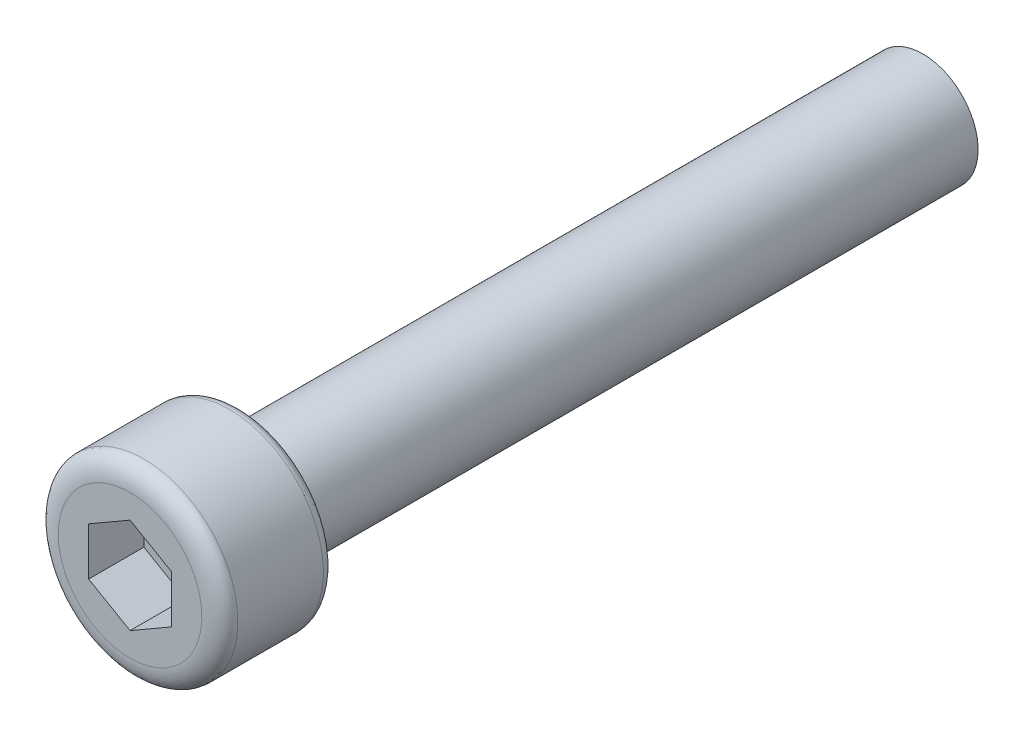
ISO-10303-21;
HEADER;
FILE_DESCRIPTION(('STEP AP214'),'2;1');
FILE_NAME('part.step','',(''),(''),'','','');
FILE_SCHEMA(('AUTOMOTIVE_DESIGN { 1 0 10303 214 1 1 1 1 }'));
ENDSEC;
DATA;
#1=APPLICATION_CONTEXT('core data for automotive mechanical design processes');
#2=APPLICATION_PROTOCOL_DEFINITION('international standard','automotive_design',2000,#1);
#3=PRODUCT_CONTEXT('',#1,'mechanical');
#4=PRODUCT('Part','Part','',(#3));
#5=PRODUCT_RELATED_PRODUCT_CATEGORY('part','',(#4));
#6=PRODUCT_DEFINITION_FORMATION('','',#4);
#7=PRODUCT_DEFINITION_CONTEXT('part definition',#1,'design');
#8=PRODUCT_DEFINITION('design','',#6,#7);
#9=PRODUCT_DEFINITION_SHAPE('','',#8);
#10=(LENGTH_UNIT() NAMED_UNIT(*) SI_UNIT(.MILLI.,.METRE.));
#11=(NAMED_UNIT(*) PLANE_ANGLE_UNIT() SI_UNIT($,.RADIAN.));
#12=(NAMED_UNIT(*) SI_UNIT($,.STERADIAN.) SOLID_ANGLE_UNIT());
#13=UNCERTAINTY_MEASURE_WITH_UNIT(LENGTH_MEASURE(1.E-05),#10,'distance_accuracy_value','');
#14=(GEOMETRIC_REPRESENTATION_CONTEXT(3) GLOBAL_UNCERTAINTY_ASSIGNED_CONTEXT((#13)) GLOBAL_UNIT_ASSIGNED_CONTEXT((#10,
#11,#12)) REPRESENTATION_CONTEXT('',''));
#15=CARTESIAN_POINT('',(0.,0.,0.));
#16=DIRECTION('',(0.,0.,1.));
#17=DIRECTION('',(1.,0.,0.));
#18=AXIS2_PLACEMENT_3D('',#15,#16,#17);
#19=CARTESIAN_POINT('',(0.,0.,14.5));
#20=DIRECTION('',(0.,0.,1.));
#21=DIRECTION('',(1.,0.,0.));
#22=AXIS2_PLACEMENT_3D('',#19,#20,#21);
#23=PLANE('',#22);
#24=DIRECTION('',(-0.866025403784439,0.5,0.));
#25=VECTOR('',#24,1.);
#26=CARTESIAN_POINT('',(1.5,0.86602540378444,14.5));
#27=LINE('',#26,#25);
#28=CARTESIAN_POINT('',(1.5,0.86602540378444,14.5));
#29=VERTEX_POINT('',#28);
#30=CARTESIAN_POINT('',(0.,1.73205080756888,14.5));
#31=VERTEX_POINT('',#30);
#32=EDGE_CURVE('E59',#29,#31,#27,.T.);
#33=ORIENTED_EDGE('',*,*,#32,.F.);
#34=DIRECTION('',(0.,1.,0.));
#35=VECTOR('',#34,1.);
#36=CARTESIAN_POINT('',(1.5,-0.866025403784439,14.5));
#37=LINE('',#36,#35);
#38=CARTESIAN_POINT('',(1.5,-0.866025403784439,14.5));
#39=VERTEX_POINT('',#38);
#40=EDGE_CURVE('E142',#39,#29,#37,.T.);
#41=ORIENTED_EDGE('',*,*,#40,.F.);
#42=DIRECTION('',(0.866025403784439,0.5,0.));
#43=VECTOR('',#42,1.);
#44=CARTESIAN_POINT('',(0.,-1.73205080756888,14.5));
#45=LINE('',#44,#43);
#46=CARTESIAN_POINT('',(0.,-1.73205080756888,14.5));
#47=VERTEX_POINT('',#46);
#48=EDGE_CURVE('E140',#47,#39,#45,.T.);
#49=ORIENTED_EDGE('',*,*,#48,.F.);
#50=DIRECTION('',(0.866025403784438,-0.5,0.));
#51=VECTOR('',#50,1.);
#52=CARTESIAN_POINT('',(-1.5,-0.866025403784438,14.5));
#53=LINE('',#52,#51);
#54=CARTESIAN_POINT('',(-1.5,-0.866025403784438,14.5));
#55=VERTEX_POINT('',#54);
#56=EDGE_CURVE('E107',#55,#47,#53,.T.);
#57=ORIENTED_EDGE('',*,*,#56,.F.);
#58=DIRECTION('',(0.,-1.,0.));
#59=VECTOR('',#58,1.);
#60=CARTESIAN_POINT('',(-1.5,0.866025403784439,14.5));
#61=LINE('',#60,#59);
#62=CARTESIAN_POINT('',(-1.5,0.866025403784439,14.5));
#63=VERTEX_POINT('',#62);
#64=EDGE_CURVE('E136',#63,#55,#61,.T.);
#65=ORIENTED_EDGE('',*,*,#64,.F.);
#66=DIRECTION('',(-0.866025403784439,-0.5,0.));
#67=VECTOR('',#66,1.);
#68=CARTESIAN_POINT('',(0.,1.73205080756888,14.5));
#69=LINE('',#68,#67);
#70=EDGE_CURVE('E133',#31,#63,#69,.T.);
#71=ORIENTED_EDGE('',*,*,#70,.F.);
#72=EDGE_LOOP('',(#33,#41,#49,#57,#65,#71));
#73=FACE_BOUND('',#72,.T.);
#74=CARTESIAN_POINT('',(-2.6,0.,14.5));
#75=CARTESIAN_POINT('',(-2.6,0.340339195747886,14.5));
#76=CARTESIAN_POINT('',(-2.53232895612653,0.680544507086417,14.5));
#77=CARTESIAN_POINT('',(-2.27184461293216,1.30940934121205,14.5));
#78=CARTESIAN_POINT('',(-2.07913378430198,1.5978214778681,14.5));
#79=CARTESIAN_POINT('',(-1.59782147786807,2.07913378430194,14.5));
#80=CARTESIAN_POINT('',(-1.30940934121205,2.27184461293216,14.5));
#81=CARTESIAN_POINT('',(-0.680544507086415,2.53232895612653,14.5));
#82=CARTESIAN_POINT('',(-0.340339195747888,2.6,14.5));
#83=CARTESIAN_POINT('',(0.340339195747889,2.6,14.5));
#84=CARTESIAN_POINT('',(0.680544507086413,2.53232895612653,14.5));
#85=CARTESIAN_POINT('',(1.30940934121205,2.27184461293216,14.5));
#86=CARTESIAN_POINT('',(1.59782147786806,2.07913378430191,14.5));
#87=CARTESIAN_POINT('',(2.07913378430199,1.59782147786813,14.5));
#88=CARTESIAN_POINT('',(2.27184461293214,1.30940934121206,14.5));
#89=CARTESIAN_POINT('',(2.53232895612655,0.680544507086402,14.5));
#90=CARTESIAN_POINT('',(2.6,0.340339195748111,14.5));
#91=CARTESIAN_POINT('',(2.6,-0.340339195748118,14.5));
#92=CARTESIAN_POINT('',(2.53232895612663,-0.68054450708615,14.5));
#93=CARTESIAN_POINT('',(2.27184461293207,-1.30940934121232,14.5));
#94=CARTESIAN_POINT('',(2.07913378430184,-1.59782147786829,14.5));
#95=CARTESIAN_POINT('',(1.59782147786821,-2.07913378430177,14.5));
#96=CARTESIAN_POINT('',(1.30940934121224,-2.27184461293209,14.5));
#97=CARTESIAN_POINT('',(0.68054450708623,-2.53232895612661,14.5));
#98=CARTESIAN_POINT('',(0.340339195748087,-2.6,14.5));
#99=CARTESIAN_POINT('',(-0.340339195748083,-2.6,14.5));
#100=CARTESIAN_POINT('',(-0.680544507086233,-2.53232895612661,14.5));
#101=CARTESIAN_POINT('',(-1.30940934121224,-2.27184461293209,14.5));
#102=CARTESIAN_POINT('',(-1.59782147786814,-2.07913378430198,14.5));
#103=CARTESIAN_POINT('',(-2.0791337843019,-1.59782147786808,14.5));
#104=CARTESIAN_POINT('',(-2.27184461293223,-1.30940934121205,14.5));
#105=CARTESIAN_POINT('',(-2.53232895612646,-0.680544507086417,14.5));
#106=CARTESIAN_POINT('',(-2.6,-0.340339195747891,14.5));
#107=CARTESIAN_POINT('',(-2.6,0.,14.5));
#108=(BOUNDED_CURVE() B_SPLINE_CURVE(3,(#74,#75,#76,#77,#78,#79,#80,#81,#82,#83,#84,#85,#86,#87,
#88,#89,#90,#91,#92,#93,#94,#95,#96,#97,#98,#99,#100,#101,#102,#103,#104,#105,#106,#107),
.UNSPECIFIED.,.T.,.F.) B_SPLINE_CURVE_WITH_KNOTS((4,2,2,2,2,2,2,2,2,2,2,2,2,2,2,2,4),
(-3.14159265358979,-2.74889357189107,-2.35619449019234,-1.96349540849362,-1.5707963267949,
-1.17809724509617,-0.785398163397448,-0.392699081698724,0.,0.392699081698724,0.785398163397448,
1.17809724509617,1.5707963267949,1.96349540849362,2.35619449019234,2.74889357189107,
3.14159265358979),
.UNSPECIFIED.) CURVE() GEOMETRIC_REPRESENTATION_ITEM() RATIONAL_B_SPLINE_CURVE((1.,1.,1.,1.,1.,
1.,1.,1.,1.,1.,1.,1.,1.,1.,1.,1.,1.,1.,1.,1.,1.,1.,1.,1.,1.,1.,1.,1.,1.,1.,1.,1.,1.,1.)) REPRESENTATION_ITEM(''));
#109=CARTESIAN_POINT('',(-2.6,0.,14.5));
#110=VERTEX_POINT('',#109);
#111=EDGE_CURVE('E12',#110,#110,#108,.F.);
#112=ORIENTED_EDGE('',*,*,#111,.T.);
#113=EDGE_LOOP('',(#112));
#114=FACE_BOUND('',#113,.T.);
#115=ADVANCED_FACE('F38',(#73,#114),#23,.T.);
#116=CARTESIAN_POINT('',(0.,0.,-14.5));
#117=DIRECTION('',(0.,0.,-1.));
#118=DIRECTION('',(-1.,0.,0.));
#119=AXIS2_PLACEMENT_3D('',#116,#117,#118);
#120=CYLINDRICAL_SURFACE('',#119,3.4);
#121=CARTESIAN_POINT('',(-3.4,0.,14.));
#122=CARTESIAN_POINT('',(-3.4,-0.445058948285703,14.));
#123=CARTESIAN_POINT('',(-3.31150709647312,-0.889942816959203,14.));
#124=CARTESIAN_POINT('',(-2.97087372460363,-1.71230452312341,14.));
#125=CARTESIAN_POINT('',(-2.71886725639482,-2.08945885567371,14.));
#126=CARTESIAN_POINT('',(-2.0894588556737,-2.71886725639483,14.));
#127=CARTESIAN_POINT('',(-1.71230452312369,-2.97087372460351,14.));
#128=CARTESIAN_POINT('',(-0.889942816958928,-3.31150709647324,14.));
#129=CARTESIAN_POINT('',(-0.445058948285955,-3.4,14.));
#130=CARTESIAN_POINT('',(0.445058948285959,-3.4,14.));
#131=CARTESIAN_POINT('',(0.889942816958924,-3.31150709647324,14.));
#132=CARTESIAN_POINT('',(1.71230452312369,-2.97087372460352,14.));
#133=CARTESIAN_POINT('',(2.08945885567385,-2.71886725639468,14.));
#134=CARTESIAN_POINT('',(2.71886725639468,-2.08945885567385,14.));
#135=CARTESIAN_POINT('',(2.97087372460348,-1.71230452312378,14.));
#136=CARTESIAN_POINT('',(3.31150709647328,-0.889942816958835,14.));
#137=CARTESIAN_POINT('',(3.4,-0.445058948285999,14.));
#138=CARTESIAN_POINT('',(3.4,0.445058948285992,14.));
#139=CARTESIAN_POINT('',(3.31150709647316,0.889942816959107,14.));
#140=CARTESIAN_POINT('',(2.97087372460359,1.7123045231235,14.));
#141=CARTESIAN_POINT('',(2.71886725639486,2.08945885567366,14.));
#142=CARTESIAN_POINT('',(2.08945885567366,2.71886725639486,14.));
#143=CARTESIAN_POINT('',(1.71230452312347,2.9708737246036,14.));
#144=CARTESIAN_POINT('',(0.889942816959137,3.31150709647315,14.));
#145=CARTESIAN_POINT('',(0.4450589482857,3.4,14.));
#146=CARTESIAN_POINT('',(-0.4450589482857,3.4,14.));
#147=CARTESIAN_POINT('',(-0.889942816959166,3.31150709647314,14.));
#148=CARTESIAN_POINT('',(-1.71230452312345,2.97087372460361,14.));
#149=CARTESIAN_POINT('',(-2.08945885567367,2.71886725639485,14.));
#150=CARTESIAN_POINT('',(-2.71886725639486,2.08945885567366,14.));
#151=CARTESIAN_POINT('',(-2.9708737246036,1.71230452312347,14.));
#152=CARTESIAN_POINT('',(-3.31150709647314,0.889942816959149,14.));
#153=CARTESIAN_POINT('',(-3.4,0.445058948285697,14.));
#154=CARTESIAN_POINT('',(-3.4,0.,14.));
#155=(BOUNDED_CURVE() B_SPLINE_CURVE(3,(#121,#122,#123,#124,#125,#126,#127,#128,#129,#130,#131,
#132,#133,#134,#135,#136,#137,#138,#139,#140,#141,#142,#143,#144,#145,#146,#147,#148,#149,#150,
#151,#152,#153,#154),.UNSPECIFIED.,.T.,.F.) B_SPLINE_CURVE_WITH_KNOTS((4,2,2,2,2,2,2,2,2,2,2,2,
2,2,2,2,4),(-3.14159265358979,-2.74889357189107,-2.35619449019234,-1.96349540849362,
-1.5707963267949,-1.17809724509617,-0.785398163397448,-0.392699081698724,0.,0.392699081698724,
0.785398163397448,1.17809724509617,1.5707963267949,1.96349540849362,2.35619449019234,
2.74889357189107,3.14159265358979),
.UNSPECIFIED.) CURVE() GEOMETRIC_REPRESENTATION_ITEM() RATIONAL_B_SPLINE_CURVE((1.,1.,1.,1.,1.,
1.,1.,1.,1.,1.,1.,1.,1.,1.,1.,1.,1.,1.,1.,1.,1.,1.,1.,1.,1.,1.,1.,1.,1.,1.,1.,1.,1.,1.)) REPRESENTATION_ITEM(''));
#156=CARTESIAN_POINT('',(-3.4,0.,14.));
#157=VERTEX_POINT('',#156);
#158=EDGE_CURVE('E52',#157,#157,#155,.F.);
#159=ORIENTED_EDGE('',*,*,#158,.T.);
#160=EDGE_LOOP('',(#159));
#161=FACE_BOUND('',#160,.T.);
#162=CARTESIAN_POINT('',(0.,0.,10.9));
#163=DIRECTION('',(0.,0.,-1.));
#164=DIRECTION('',(-1.,0.,0.));
#165=AXIS2_PLACEMENT_3D('',#162,#163,#164);
#166=CIRCLE('',#165,3.4);
#167=CARTESIAN_POINT('',(-3.4,0.,10.9));
#168=VERTEX_POINT('',#167);
#169=EDGE_CURVE('E163',#168,#168,#166,.F.);
#170=ORIENTED_EDGE('',*,*,#169,.T.);
#171=EDGE_LOOP('',(#170));
#172=FACE_BOUND('',#171,.T.);
#173=ADVANCED_FACE('F175',(#161,#172),#120,.T.);
#174=CARTESIAN_POINT('',(0.,3.4,10.5));
#175=DIRECTION('',(0.,0.,-1.));
#176=DIRECTION('',(-1.,0.,0.));
#177=AXIS2_PLACEMENT_3D('',#174,#175,#176);
#178=PLANE('',#177);
#179=CARTESIAN_POINT('',(0.,0.,10.5));
#180=DIRECTION('',(0.,0.,-1.));
#181=DIRECTION('',(-1.,0.,0.));
#182=AXIS2_PLACEMENT_3D('',#179,#180,#181);
#183=CIRCLE('',#182,3.);
#184=CARTESIAN_POINT('',(-3.,0.,10.5));
#185=VERTEX_POINT('',#184);
#186=EDGE_CURVE('E160',#185,#185,#183,.T.);
#187=ORIENTED_EDGE('',*,*,#186,.T.);
#188=EDGE_LOOP('',(#187));
#189=FACE_BOUND('',#188,.T.);
#190=CARTESIAN_POINT('',(0.,0.,10.5));
#191=DIRECTION('',(0.,0.,-1.));
#192=DIRECTION('',(-1.,0.,0.));
#193=AXIS2_PLACEMENT_3D('',#190,#191,#192);
#194=CIRCLE('',#193,2.);
#195=CARTESIAN_POINT('',(-2.,0.,10.5));
#196=VERTEX_POINT('',#195);
#197=EDGE_CURVE('E146',#196,#196,#194,.T.);
#198=ORIENTED_EDGE('',*,*,#197,.F.);
#199=EDGE_LOOP('',(#198));
#200=FACE_BOUND('',#199,.T.);
#201=ADVANCED_FACE('F185',(#189,#200),#178,.T.);
#202=CARTESIAN_POINT('',(0.,0.,-14.5));
#203=DIRECTION('',(0.,0.,-1.));
#204=DIRECTION('',(-1.,0.,0.));
#205=AXIS2_PLACEMENT_3D('',#202,#203,#204);
#206=CYLINDRICAL_SURFACE('',#205,2.);
#207=CARTESIAN_POINT('',(0.,0.,-14.2));
#208=DIRECTION('',(0.,0.,-1.));
#209=DIRECTION('',(-1.,0.,0.));
#210=AXIS2_PLACEMENT_3D('',#207,#208,#209);
#211=CIRCLE('',#210,2.);
#212=CARTESIAN_POINT('',(-2.,0.,-14.2));
#213=VERTEX_POINT('',#212);
#214=EDGE_CURVE('E157',#213,#213,#211,.F.);
#215=ORIENTED_EDGE('',*,*,#214,.T.);
#216=EDGE_LOOP('',(#215));
#217=FACE_BOUND('',#216,.T.);
#218=ORIENTED_EDGE('',*,*,#197,.T.);
#219=EDGE_LOOP('',(#218));
#220=FACE_BOUND('',#219,.T.);
#221=ADVANCED_FACE('F234',(#217,#220),#206,.T.);
#222=CARTESIAN_POINT('',(0.,2.,-14.5));
#223=DIRECTION('',(0.,0.,-1.));
#224=DIRECTION('',(-1.,0.,0.));
#225=AXIS2_PLACEMENT_3D('',#222,#223,#224);
#226=PLANE('',#225);
#227=CARTESIAN_POINT('',(0.,0.,-14.5));
#228=DIRECTION('',(0.,0.,-1.));
#229=DIRECTION('',(-1.,0.,0.));
#230=AXIS2_PLACEMENT_3D('',#227,#228,#229);
#231=CIRCLE('',#230,1.48038475772934);
#232=CARTESIAN_POINT('',(-1.48038475772934,0.,-14.5));
#233=VERTEX_POINT('',#232);
#234=EDGE_CURVE('E154',#233,#233,#231,.T.);
#235=ORIENTED_EDGE('',*,*,#234,.T.);
#236=EDGE_LOOP('',(#235));
#237=FACE_BOUND('',#236,.T.);
#238=ADVANCED_FACE('F226',(#237),#226,.T.);
#239=CARTESIAN_POINT('',(0.,0.,-14.5));
#240=DIRECTION('',(0.,0.,1.));
#241=DIRECTION('',(1.,0.,0.));
#242=AXIS2_PLACEMENT_3D('',#239,#240,#241);
#243=CONICAL_SURFACE('',#242,1.48038475772934,1.04719755119659);
#244=ORIENTED_EDGE('',*,*,#214,.F.);
#245=EDGE_LOOP('',(#244));
#246=FACE_BOUND('',#245,.T.);
#247=ORIENTED_EDGE('',*,*,#234,.F.);
#248=EDGE_LOOP('',(#247));
#249=FACE_BOUND('',#248,.T.);
#250=ADVANCED_FACE('F192',(#246,#249),#243,.T.);
#251=CARTESIAN_POINT('',(0.,0.,10.9));
#252=DIRECTION('',(0.,0.,-1.));
#253=DIRECTION('',(-1.,0.,0.));
#254=AXIS2_PLACEMENT_3D('',#251,#252,#253);
#255=TOROIDAL_SURFACE('',#254,3.,0.4);
#256=ORIENTED_EDGE('',*,*,#169,.F.);
#257=EDGE_LOOP('',(#256));
#258=FACE_BOUND('',#257,.T.);
#259=ORIENTED_EDGE('',*,*,#186,.F.);
#260=EDGE_LOOP('',(#259));
#261=FACE_BOUND('',#260,.T.);
#262=ADVANCED_FACE('F215',(#258,#261),#255,.T.);
#263=CARTESIAN_POINT('',(-2.6,0.,14.5));
#264=CARTESIAN_POINT('',(-2.6,-0.340339195747891,14.5));
#265=CARTESIAN_POINT('',(-2.53232895612646,-0.680544507086417,14.5));
#266=CARTESIAN_POINT('',(-2.27184461293223,-1.30940934121205,14.5));
#267=CARTESIAN_POINT('',(-2.0791337843019,-1.59782147786808,14.5));
#268=CARTESIAN_POINT('',(-1.59782147786814,-2.07913378430198,14.5));
#269=CARTESIAN_POINT('',(-1.30940934121224,-2.27184461293209,14.5));
#270=CARTESIAN_POINT('',(-0.680544507086233,-2.53232895612661,14.5));
#271=CARTESIAN_POINT('',(-0.340339195748083,-2.6,14.5));
#272=CARTESIAN_POINT('',(0.340339195748087,-2.6,14.5));
#273=CARTESIAN_POINT('',(0.68054450708623,-2.53232895612661,14.5));
#274=CARTESIAN_POINT('',(1.30940934121224,-2.27184461293209,14.5));
#275=CARTESIAN_POINT('',(1.59782147786821,-2.07913378430177,14.5));
#276=CARTESIAN_POINT('',(2.07913378430184,-1.59782147786829,14.5));
#277=CARTESIAN_POINT('',(2.27184461293207,-1.30940934121232,14.5));
#278=CARTESIAN_POINT('',(2.53232895612663,-0.68054450708615,14.5));
#279=CARTESIAN_POINT('',(2.6,-0.340339195748118,14.5));
#280=CARTESIAN_POINT('',(2.6,0.340339195748111,14.5));
#281=CARTESIAN_POINT('',(2.53232895612655,0.680544507086402,14.5));
#282=CARTESIAN_POINT('',(2.27184461293214,1.30940934121206,14.5));
#283=CARTESIAN_POINT('',(2.07913378430199,1.59782147786813,14.5));
#284=CARTESIAN_POINT('',(1.59782147786806,2.07913378430191,14.5));
#285=CARTESIAN_POINT('',(1.30940934121205,2.27184461293216,14.5));
#286=CARTESIAN_POINT('',(0.680544507086413,2.53232895612653,14.5));
#287=CARTESIAN_POINT('',(0.340339195747889,2.6,14.5));
#288=CARTESIAN_POINT('',(-0.340339195747888,2.6,14.5));
#289=CARTESIAN_POINT('',(-0.680544507086415,2.53232895612653,14.5));
#290=CARTESIAN_POINT('',(-1.30940934121205,2.27184461293216,14.5));
#291=CARTESIAN_POINT('',(-1.59782147786807,2.07913378430194,14.5));
#292=CARTESIAN_POINT('',(-2.07913378430198,1.5978214778681,14.5));
#293=CARTESIAN_POINT('',(-2.27184461293216,1.30940934121205,14.5));
#294=CARTESIAN_POINT('',(-2.53232895612653,0.680544507086417,14.5));
#295=CARTESIAN_POINT('',(-2.6,0.340339195747886,14.5));
#296=CARTESIAN_POINT('',(-2.6,0.,14.5));
#297=CARTESIAN_POINT('',(-3.4,0.,14.5));
#298=CARTESIAN_POINT('',(-3.4,-0.445058948285703,14.5));
#299=CARTESIAN_POINT('',(-3.31150709647311,-0.889942816959199,14.5));
#300=CARTESIAN_POINT('',(-2.97087372460364,-1.71230452312341,14.5));
#301=CARTESIAN_POINT('',(-2.71886725639478,-2.08945885567367,14.5));
#302=CARTESIAN_POINT('',(-2.08945885567374,-2.71886725639486,14.5));
#303=CARTESIAN_POINT('',(-1.7123045231237,-2.97087372460352,14.5));
#304=CARTESIAN_POINT('',(-0.889942816958926,-3.31150709647323,14.5));
#305=CARTESIAN_POINT('',(-0.445058948285955,-3.4,14.5));
#306=CARTESIAN_POINT('',(0.445058948285959,-3.4,14.5));
#307=CARTESIAN_POINT('',(0.889942816958922,-3.31150709647324,14.5));
#308=CARTESIAN_POINT('',(1.71230452312369,-2.97087372460352,14.5));
#309=CARTESIAN_POINT('',(2.08945885567385,-2.71886725639468,14.5));
#310=CARTESIAN_POINT('',(2.71886725639468,-2.08945885567385,14.5));
#311=CARTESIAN_POINT('',(2.9708737246035,-1.71230452312379,14.5));
#312=CARTESIAN_POINT('',(3.31150709647326,-0.889942816958827,14.5));
#313=CARTESIAN_POINT('',(3.4,-0.445058948285999,14.5));
#314=CARTESIAN_POINT('',(3.4,0.445058948285992,14.5));
#315=CARTESIAN_POINT('',(3.31150709647318,0.889942816959117,14.5));
#316=CARTESIAN_POINT('',(2.97087372460357,1.71230452312349,14.5));
#317=CARTESIAN_POINT('',(2.71886725639482,2.08945885567362,14.5));
#318=CARTESIAN_POINT('',(2.0894588556737,2.71886725639489,14.5));
#319=CARTESIAN_POINT('',(1.71230452312347,2.97087372460359,14.5));
#320=CARTESIAN_POINT('',(0.889942816959141,3.31150709647316,14.5));
#321=CARTESIAN_POINT('',(0.4450589482857,3.4,14.5));
#322=CARTESIAN_POINT('',(-0.4450589482857,3.4,14.5));
#323=CARTESIAN_POINT('',(-0.889942816959144,3.31150709647308,14.5));
#324=CARTESIAN_POINT('',(-1.71230452312347,2.97087372460366,14.5));
#325=CARTESIAN_POINT('',(-2.08945885567367,2.71886725639485,14.5));
#326=CARTESIAN_POINT('',(-2.71886725639486,2.08945885567366,14.5));
#327=CARTESIAN_POINT('',(-2.97087372460357,1.71230452312345,14.5));
#328=CARTESIAN_POINT('',(-3.31150709647318,0.889942816959165,14.5));
#329=CARTESIAN_POINT('',(-3.4,0.445058948285697,14.5));
#330=CARTESIAN_POINT('',(-3.4,0.,14.5));
#331=CARTESIAN_POINT('',(-3.4,0.,14.));
#332=CARTESIAN_POINT('',(-3.4,-0.445058948285703,14.));
#333=CARTESIAN_POINT('',(-3.31150709647312,-0.889942816959203,14.));
#334=CARTESIAN_POINT('',(-2.97087372460363,-1.71230452312341,14.));
#335=CARTESIAN_POINT('',(-2.71886725639482,-2.08945885567371,14.));
#336=CARTESIAN_POINT('',(-2.0894588556737,-2.71886725639483,14.));
#337=CARTESIAN_POINT('',(-1.71230452312369,-2.97087372460351,14.));
#338=CARTESIAN_POINT('',(-0.889942816958928,-3.31150709647324,14.));
#339=CARTESIAN_POINT('',(-0.445058948285955,-3.4,14.));
#340=CARTESIAN_POINT('',(0.445058948285959,-3.4,14.));
#341=CARTESIAN_POINT('',(0.889942816958924,-3.31150709647324,14.));
#342=CARTESIAN_POINT('',(1.71230452312369,-2.97087372460352,14.));
#343=CARTESIAN_POINT('',(2.08945885567385,-2.71886725639468,14.));
#344=CARTESIAN_POINT('',(2.71886725639468,-2.08945885567385,14.));
#345=CARTESIAN_POINT('',(2.97087372460348,-1.71230452312378,14.));
#346=CARTESIAN_POINT('',(3.31150709647328,-0.889942816958835,14.));
#347=CARTESIAN_POINT('',(3.4,-0.445058948285999,14.));
#348=CARTESIAN_POINT('',(3.4,0.445058948285992,14.));
#349=CARTESIAN_POINT('',(3.31150709647316,0.889942816959107,14.));
#350=CARTESIAN_POINT('',(2.97087372460359,1.7123045231235,14.));
#351=CARTESIAN_POINT('',(2.71886725639486,2.08945885567366,14.));
#352=CARTESIAN_POINT('',(2.08945885567366,2.71886725639486,14.));
#353=CARTESIAN_POINT('',(1.71230452312347,2.9708737246036,14.));
#354=CARTESIAN_POINT('',(0.889942816959137,3.31150709647315,14.));
#355=CARTESIAN_POINT('',(0.4450589482857,3.4,14.));
#356=CARTESIAN_POINT('',(-0.4450589482857,3.4,14.));
#357=CARTESIAN_POINT('',(-0.889942816959166,3.31150709647314,14.));
#358=CARTESIAN_POINT('',(-1.71230452312345,2.97087372460361,14.));
#359=CARTESIAN_POINT('',(-2.08945885567367,2.71886725639485,14.));
#360=CARTESIAN_POINT('',(-2.71886725639486,2.08945885567366,14.));
#361=CARTESIAN_POINT('',(-2.9708737246036,1.71230452312347,14.));
#362=CARTESIAN_POINT('',(-3.31150709647314,0.889942816959149,14.));
#363=CARTESIAN_POINT('',(-3.4,0.445058948285697,14.));
#364=CARTESIAN_POINT('',(-3.4,0.,14.));
#365=(BOUNDED_SURFACE() B_SPLINE_SURFACE(2,3,((#263,#264,#265,#266,#267,#268,#269,#270,#271,
#272,#273,#274,#275,#276,#277,#278,#279,#280,#281,#282,#283,#284,#285,#286,#287,#288,#289,#290,
#291,#292,#293,#294,#295,#296),(#297,#298,#299,#300,#301,#302,#303,#304,#305,#306,#307,#308,
#309,#310,#311,#312,#313,#314,#315,#316,#317,#318,#319,#320,#321,#322,#323,#324,#325,#326,#327,
#328,#329,#330),(#331,#332,#333,#334,#335,#336,#337,#338,#339,#340,#341,#342,#343,#344,#345,
#346,#347,#348,#349,#350,#351,#352,#353,#354,#355,#356,#357,#358,#359,#360,#361,#362,#363,
#364)),.UNSPECIFIED.,.F.,.T.,.F.) B_SPLINE_SURFACE_WITH_KNOTS((3,3),(4,2,2,2,2,2,2,2,2,2,2,2,2,
2,2,2,4),(0.,1.),(-3.14159265358979,-2.74889357189107,-2.35619449019234,-1.96349540849362,
-1.5707963267949,-1.17809724509617,-0.785398163397448,-0.392699081698724,0.,0.392699081698724,
0.785398163397448,1.17809724509617,1.5707963267949,1.96349540849362,2.35619449019234,
2.74889357189107,3.14159265358979),
.UNSPECIFIED.) GEOMETRIC_REPRESENTATION_ITEM() RATIONAL_B_SPLINE_SURFACE(((1.,1.,1.,1.,1.,1.,1.,
1.,1.,1.,1.,1.,1.,1.,1.,1.,1.,1.,1.,1.,1.,1.,1.,1.,1.,1.,1.,1.,1.,1.,1.,1.,1.,1.),
(0.707106781186548,0.707106781186548,0.707106781186548,0.707106781186548,0.707106781186547,
0.707106781186547,0.707106781186548,0.707106781186548,0.707106781186548,0.707106781186548,
0.707106781186548,0.707106781186548,0.707106781186548,0.707106781186548,0.707106781186548,
0.707106781186548,0.707106781186548,0.707106781186548,0.707106781186548,0.707106781186548,
0.707106781186547,0.707106781186547,0.707106781186548,0.707106781186548,0.707106781186548,
0.707106781186548,0.707106781186548,0.707106781186548,0.707106781186548,0.707106781186548,
0.707106781186548,0.707106781186548,0.707106781186548,0.707106781186548),(1.,1.,1.,1.,1.,1.,1.,
1.,1.,1.,1.,1.,1.,1.,1.,1.,1.,1.,1.,1.,1.,1.,1.,1.,1.,1.,1.,1.,1.,1.,1.,1.,1.,1.))) REPRESENTATION_ITEM('') SURFACE());
#366=ORIENTED_EDGE('',*,*,#111,.F.);
#367=EDGE_LOOP('',(#366));
#368=FACE_BOUND('',#367,.T.);
#369=ORIENTED_EDGE('',*,*,#158,.F.);
#370=EDGE_LOOP('',(#369));
#371=FACE_BOUND('',#370,.T.);
#372=ADVANCED_FACE('F41',(#368,#371),#365,.T.);
#373=CARTESIAN_POINT('',(1.5,0.86602540378444,12.5));
#374=DIRECTION('',(0.5,0.866025403784439,0.));
#375=DIRECTION('',(-0.866025403784439,0.5,0.));
#376=AXIS2_PLACEMENT_3D('',#373,#374,#375);
#377=PLANE('',#376);
#378=ORIENTED_EDGE('',*,*,#32,.T.);
#379=DIRECTION('',(0.,0.,1.));
#380=VECTOR('',#379,1.);
#381=CARTESIAN_POINT('',(0.,1.73205080756888,12.5));
#382=LINE('',#381,#380);
#383=CARTESIAN_POINT('',(0.,1.73205080756888,12.5));
#384=VERTEX_POINT('',#383);
#385=EDGE_CURVE('E89',#384,#31,#382,.T.);
#386=ORIENTED_EDGE('',*,*,#385,.F.);
#387=DIRECTION('',(-0.866025403784439,0.5,0.));
#388=VECTOR('',#387,1.);
#389=CARTESIAN_POINT('',(1.5,0.86602540378444,12.5));
#390=LINE('',#389,#388);
#391=CARTESIAN_POINT('',(1.5,0.86602540378444,12.5));
#392=VERTEX_POINT('',#391);
#393=EDGE_CURVE('E144',#392,#384,#390,.T.);
#394=ORIENTED_EDGE('',*,*,#393,.F.);
#395=DIRECTION('',(0.,0.,1.));
#396=VECTOR('',#395,1.);
#397=CARTESIAN_POINT('',(1.5,0.86602540378444,12.5));
#398=LINE('',#397,#396);
#399=EDGE_CURVE('E67',#392,#29,#398,.T.);
#400=ORIENTED_EDGE('',*,*,#399,.T.);
#401=EDGE_LOOP('',(#378,#386,#394,#400));
#402=FACE_BOUND('',#401,.T.);
#403=ADVANCED_FACE('F214',(#402),#377,.F.);
#404=CARTESIAN_POINT('',(1.5,-0.866025403784439,12.5));
#405=DIRECTION('',(1.,0.,0.));
#406=DIRECTION('',(0.,0.,-1.));
#407=AXIS2_PLACEMENT_3D('',#404,#405,#406);
#408=PLANE('',#407);
#409=ORIENTED_EDGE('',*,*,#40,.T.);
#410=ORIENTED_EDGE('',*,*,#399,.F.);
#411=DIRECTION('',(0.,1.,0.));
#412=VECTOR('',#411,1.);
#413=CARTESIAN_POINT('',(1.5,-0.866025403784439,12.5));
#414=LINE('',#413,#412);
#415=CARTESIAN_POINT('',(1.5,-0.866025403784439,12.5));
#416=VERTEX_POINT('',#415);
#417=EDGE_CURVE('E119',#416,#392,#414,.T.);
#418=ORIENTED_EDGE('',*,*,#417,.F.);
#419=DIRECTION('',(0.,0.,1.));
#420=VECTOR('',#419,1.);
#421=CARTESIAN_POINT('',(1.5,-0.866025403784439,12.5));
#422=LINE('',#421,#420);
#423=EDGE_CURVE('E111',#416,#39,#422,.T.);
#424=ORIENTED_EDGE('',*,*,#423,.T.);
#425=EDGE_LOOP('',(#409,#410,#418,#424));
#426=FACE_BOUND('',#425,.T.);
#427=ADVANCED_FACE('F220',(#426),#408,.F.);
#428=CARTESIAN_POINT('',(0.,-1.73205080756888,12.5));
#429=DIRECTION('',(0.5,-0.866025403784439,0.));
#430=DIRECTION('',(0.866025403784439,0.5,0.));
#431=AXIS2_PLACEMENT_3D('',#428,#429,#430);
#432=PLANE('',#431);
#433=ORIENTED_EDGE('',*,*,#48,.T.);
#434=ORIENTED_EDGE('',*,*,#423,.F.);
#435=DIRECTION('',(0.866025403784439,0.5,0.));
#436=VECTOR('',#435,1.);
#437=CARTESIAN_POINT('',(0.,-1.73205080756888,12.5));
#438=LINE('',#437,#436);
#439=CARTESIAN_POINT('',(0.,-1.73205080756888,12.5));
#440=VERTEX_POINT('',#439);
#441=EDGE_CURVE('E115',#440,#416,#438,.T.);
#442=ORIENTED_EDGE('',*,*,#441,.F.);
#443=DIRECTION('',(0.,0.,1.));
#444=VECTOR('',#443,1.);
#445=CARTESIAN_POINT('',(0.,-1.73205080756888,12.5));
#446=LINE('',#445,#444);
#447=EDGE_CURVE('E100',#440,#47,#446,.T.);
#448=ORIENTED_EDGE('',*,*,#447,.T.);
#449=EDGE_LOOP('',(#433,#434,#442,#448));
#450=FACE_BOUND('',#449,.T.);
#451=ADVANCED_FACE('F116',(#450),#432,.F.);
#452=CARTESIAN_POINT('',(-1.5,-0.866025403784438,12.5));
#453=DIRECTION('',(-0.5,-0.866025403784439,0.));
#454=DIRECTION('',(0.866025403784439,-0.5,0.));
#455=AXIS2_PLACEMENT_3D('',#452,#453,#454);
#456=PLANE('',#455);
#457=ORIENTED_EDGE('',*,*,#56,.T.);
#458=ORIENTED_EDGE('',*,*,#447,.F.);
#459=DIRECTION('',(0.866025403784438,-0.5,0.));
#460=VECTOR('',#459,1.);
#461=CARTESIAN_POINT('',(-1.5,-0.866025403784438,12.5));
#462=LINE('',#461,#460);
#463=CARTESIAN_POINT('',(-1.5,-0.866025403784438,12.5));
#464=VERTEX_POINT('',#463);
#465=EDGE_CURVE('E104',#464,#440,#462,.T.);
#466=ORIENTED_EDGE('',*,*,#465,.F.);
#467=DIRECTION('',(0.,0.,1.));
#468=VECTOR('',#467,1.);
#469=CARTESIAN_POINT('',(-1.5,-0.866025403784438,12.5));
#470=LINE('',#469,#468);
#471=EDGE_CURVE('E112',#464,#55,#470,.T.);
#472=ORIENTED_EDGE('',*,*,#471,.T.);
#473=EDGE_LOOP('',(#457,#458,#466,#472));
#474=FACE_BOUND('',#473,.T.);
#475=ADVANCED_FACE('F102',(#474),#456,.F.);
#476=CARTESIAN_POINT('',(-1.5,0.866025403784439,12.5));
#477=DIRECTION('',(-1.,0.,0.));
#478=DIRECTION('',(0.,0.,1.));
#479=AXIS2_PLACEMENT_3D('',#476,#477,#478);
#480=PLANE('',#479);
#481=ORIENTED_EDGE('',*,*,#64,.T.);
#482=ORIENTED_EDGE('',*,*,#471,.F.);
#483=DIRECTION('',(0.,-1.,0.));
#484=VECTOR('',#483,1.);
#485=CARTESIAN_POINT('',(-1.5,0.866025403784439,12.5));
#486=LINE('',#485,#484);
#487=CARTESIAN_POINT('',(-1.5,0.866025403784439,12.5));
#488=VERTEX_POINT('',#487);
#489=EDGE_CURVE('E125',#488,#464,#486,.T.);
#490=ORIENTED_EDGE('',*,*,#489,.F.);
#491=DIRECTION('',(0.,0.,1.));
#492=VECTOR('',#491,1.);
#493=CARTESIAN_POINT('',(-1.5,0.866025403784439,12.5));
#494=LINE('',#493,#492);
#495=EDGE_CURVE('E149',#488,#63,#494,.T.);
#496=ORIENTED_EDGE('',*,*,#495,.T.);
#497=EDGE_LOOP('',(#481,#482,#490,#496));
#498=FACE_BOUND('',#497,.T.);
#499=ADVANCED_FACE('F248',(#498),#480,.F.);
#500=CARTESIAN_POINT('',(0.,1.73205080756888,12.5));
#501=DIRECTION('',(-0.5,0.866025403784439,0.));
#502=DIRECTION('',(-0.866025403784439,-0.5,0.));
#503=AXIS2_PLACEMENT_3D('',#500,#501,#502);
#504=PLANE('',#503);
#505=ORIENTED_EDGE('',*,*,#70,.T.);
#506=ORIENTED_EDGE('',*,*,#495,.F.);
#507=DIRECTION('',(-0.866025403784439,-0.5,0.));
#508=VECTOR('',#507,1.);
#509=CARTESIAN_POINT('',(0.,1.73205080756888,12.5));
#510=LINE('',#509,#508);
#511=EDGE_CURVE('E127',#384,#488,#510,.T.);
#512=ORIENTED_EDGE('',*,*,#511,.F.);
#513=ORIENTED_EDGE('',*,*,#385,.T.);
#514=EDGE_LOOP('',(#505,#506,#512,#513));
#515=FACE_BOUND('',#514,.T.);
#516=ADVANCED_FACE('F245',(#515),#504,.F.);
#517=CARTESIAN_POINT('',(0.,0.,12.5));
#518=DIRECTION('',(0.,0.,1.));
#519=DIRECTION('',(1.,0.,0.));
#520=AXIS2_PLACEMENT_3D('',#517,#518,#519);
#521=PLANE('',#520);
#522=ORIENTED_EDGE('',*,*,#393,.T.);
#523=ORIENTED_EDGE('',*,*,#511,.T.);
#524=ORIENTED_EDGE('',*,*,#489,.T.);
#525=ORIENTED_EDGE('',*,*,#465,.T.);
#526=ORIENTED_EDGE('',*,*,#441,.T.);
#527=ORIENTED_EDGE('',*,*,#417,.T.);
#528=EDGE_LOOP('',(#522,#523,#524,#525,#526,#527));
#529=FACE_BOUND('',#528,.T.);
#530=ADVANCED_FACE('F122',(#529),#521,.T.);
#531=CLOSED_SHELL('',(#115,#173,#201,#221,#238,#250,#262,#372,#403,#427,#451,#475,#499,#516,#530));
#532=MANIFOLD_SOLID_BREP('B2',#531);
#533=ADVANCED_BREP_SHAPE_REPRESENTATION('',(#18,#532),#14);
#534=SHAPE_DEFINITION_REPRESENTATION(#9,#533);
ENDSEC;
END-ISO-10303-21;
